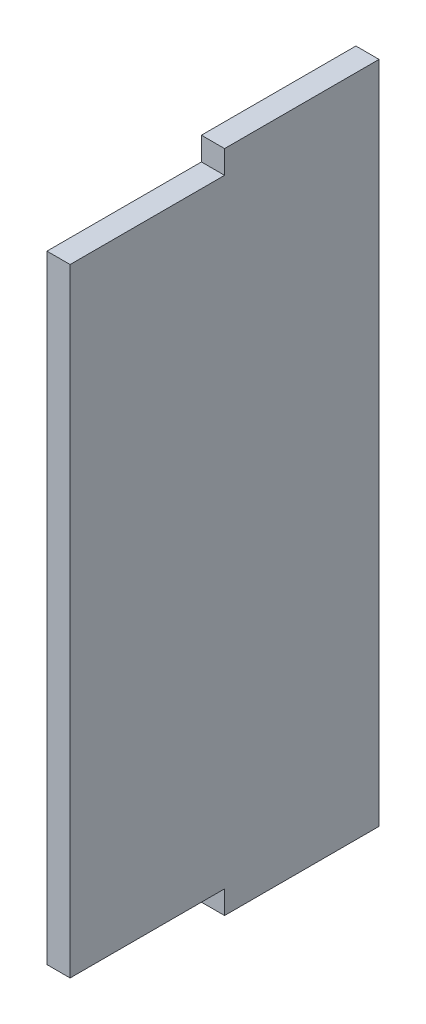
ISO-10303-21;
HEADER;
FILE_DESCRIPTION(('STEP AP214'),'2;1');
FILE_NAME('part.step','',(''),(''),'','','');
FILE_SCHEMA(('AUTOMOTIVE_DESIGN { 1 0 10303 214 1 1 1 1 }'));
ENDSEC;
DATA;
#1=APPLICATION_CONTEXT('core data for automotive mechanical design processes');
#2=APPLICATION_PROTOCOL_DEFINITION('international standard','automotive_design',2000,#1);
#3=PRODUCT_CONTEXT('',#1,'mechanical');
#4=PRODUCT('Part','Part','',(#3));
#5=PRODUCT_RELATED_PRODUCT_CATEGORY('part','',(#4));
#6=PRODUCT_DEFINITION_FORMATION('','',#4);
#7=PRODUCT_DEFINITION_CONTEXT('part definition',#1,'design');
#8=PRODUCT_DEFINITION('design','',#6,#7);
#9=PRODUCT_DEFINITION_SHAPE('','',#8);
#10=(LENGTH_UNIT() NAMED_UNIT(*) SI_UNIT(.MILLI.,.METRE.));
#11=(NAMED_UNIT(*) PLANE_ANGLE_UNIT() SI_UNIT($,.RADIAN.));
#12=(NAMED_UNIT(*) SI_UNIT($,.STERADIAN.) SOLID_ANGLE_UNIT());
#13=UNCERTAINTY_MEASURE_WITH_UNIT(LENGTH_MEASURE(1.E-05),#10,'distance_accuracy_value','');
#14=(GEOMETRIC_REPRESENTATION_CONTEXT(3) GLOBAL_UNCERTAINTY_ASSIGNED_CONTEXT((#13)) GLOBAL_UNIT_ASSIGNED_CONTEXT((#10,
#11,#12)) REPRESENTATION_CONTEXT('',''));
#15=CARTESIAN_POINT('',(0.,0.,0.));
#16=DIRECTION('',(0.,0.,1.));
#17=DIRECTION('',(1.,0.,0.));
#18=AXIS2_PLACEMENT_3D('',#15,#16,#17);
#19=CARTESIAN_POINT('',(-3.,3.,20.));
#20=DIRECTION('',(0.,1.,0.));
#21=DIRECTION('',(0.,0.,1.));
#22=AXIS2_PLACEMENT_3D('',#19,#20,#21);
#23=PLANE('',#22);
#24=DIRECTION('',(0.,0.,1.));
#25=VECTOR('',#24,1.);
#26=CARTESIAN_POINT('',(0.,3.,20.));
#27=LINE('',#26,#25);
#28=CARTESIAN_POINT('',(0.,3.,20.));
#29=VERTEX_POINT('',#28);
#30=CARTESIAN_POINT('',(0.,3.,40.));
#31=VERTEX_POINT('',#30);
#32=EDGE_CURVE('E118',#29,#31,#27,.T.);
#33=ORIENTED_EDGE('',*,*,#32,.T.);
#34=DIRECTION('',(1.,0.,0.));
#35=VECTOR('',#34,1.);
#36=CARTESIAN_POINT('',(-3.,3.,40.));
#37=LINE('',#36,#35);
#38=CARTESIAN_POINT('',(-3.,3.,40.));
#39=VERTEX_POINT('',#38);
#40=EDGE_CURVE('E10',#39,#31,#37,.T.);
#41=ORIENTED_EDGE('',*,*,#40,.F.);
#42=DIRECTION('',(0.,0.,1.));
#43=VECTOR('',#42,1.);
#44=CARTESIAN_POINT('',(-3.,3.,20.));
#45=LINE('',#44,#43);
#46=CARTESIAN_POINT('',(-3.,3.,20.));
#47=VERTEX_POINT('',#46);
#48=EDGE_CURVE('E112',#47,#39,#45,.T.);
#49=ORIENTED_EDGE('',*,*,#48,.F.);
#50=DIRECTION('',(1.,0.,0.));
#51=VECTOR('',#50,1.);
#52=CARTESIAN_POINT('',(-3.,3.,20.));
#53=LINE('',#52,#51);
#54=EDGE_CURVE('E108',#47,#29,#53,.T.);
#55=ORIENTED_EDGE('',*,*,#54,.T.);
#56=EDGE_LOOP('',(#33,#41,#49,#55));
#57=FACE_BOUND('',#56,.T.);
#58=ADVANCED_FACE('F16',(#57),#23,.F.);
#59=CARTESIAN_POINT('',(-3.,3.,40.));
#60=DIRECTION('',(0.,0.,-1.));
#61=DIRECTION('',(-1.,0.,0.));
#62=AXIS2_PLACEMENT_3D('',#59,#60,#61);
#63=PLANE('',#62);
#64=DIRECTION('',(0.,1.,0.));
#65=VECTOR('',#64,1.);
#66=CARTESIAN_POINT('',(0.,3.,40.));
#67=LINE('',#66,#65);
#68=CARTESIAN_POINT('',(0.,83.,40.));
#69=VERTEX_POINT('',#68);
#70=EDGE_CURVE('E114',#31,#69,#67,.T.);
#71=ORIENTED_EDGE('',*,*,#70,.T.);
#72=DIRECTION('',(1.,0.,0.));
#73=VECTOR('',#72,1.);
#74=CARTESIAN_POINT('',(-2.99999999999999,83.,40.));
#75=LINE('',#74,#73);
#76=CARTESIAN_POINT('',(-2.99999999999999,83.,40.));
#77=VERTEX_POINT('',#76);
#78=EDGE_CURVE('E24',#77,#69,#75,.T.);
#79=ORIENTED_EDGE('',*,*,#78,.F.);
#80=DIRECTION('',(0.,1.,0.));
#81=VECTOR('',#80,1.);
#82=CARTESIAN_POINT('',(-3.,3.,40.));
#83=LINE('',#82,#81);
#84=EDGE_CURVE('E75',#39,#77,#83,.T.);
#85=ORIENTED_EDGE('',*,*,#84,.F.);
#86=ORIENTED_EDGE('',*,*,#40,.T.);
#87=EDGE_LOOP('',(#71,#79,#85,#86));
#88=FACE_BOUND('',#87,.T.);
#89=ADVANCED_FACE('F169',(#88),#63,.F.);
#90=CARTESIAN_POINT('',(-2.99999999999999,83.,40.));
#91=DIRECTION('',(0.,-1.,0.));
#92=DIRECTION('',(0.,0.,-1.));
#93=AXIS2_PLACEMENT_3D('',#90,#91,#92);
#94=PLANE('',#93);
#95=DIRECTION('',(0.,0.,-1.));
#96=VECTOR('',#95,1.);
#97=CARTESIAN_POINT('',(0.,83.,40.));
#98=LINE('',#97,#96);
#99=CARTESIAN_POINT('',(0.,83.,20.));
#100=VERTEX_POINT('',#99);
#101=EDGE_CURVE('E117',#69,#100,#98,.T.);
#102=ORIENTED_EDGE('',*,*,#101,.T.);
#103=DIRECTION('',(1.,0.,0.));
#104=VECTOR('',#103,1.);
#105=CARTESIAN_POINT('',(-2.99999999999999,83.,20.));
#106=LINE('',#105,#104);
#107=CARTESIAN_POINT('',(-2.99999999999999,83.,20.));
#108=VERTEX_POINT('',#107);
#109=EDGE_CURVE('E142',#108,#100,#106,.T.);
#110=ORIENTED_EDGE('',*,*,#109,.F.);
#111=DIRECTION('',(0.,0.,-1.));
#112=VECTOR('',#111,1.);
#113=CARTESIAN_POINT('',(-2.99999999999999,83.,40.));
#114=LINE('',#113,#112);
#115=EDGE_CURVE('E150',#77,#108,#114,.T.);
#116=ORIENTED_EDGE('',*,*,#115,.F.);
#117=ORIENTED_EDGE('',*,*,#78,.T.);
#118=EDGE_LOOP('',(#102,#110,#116,#117));
#119=FACE_BOUND('',#118,.T.);
#120=ADVANCED_FACE('F148',(#119),#94,.F.);
#121=CARTESIAN_POINT('',(-2.99999999999999,83.,20.));
#122=DIRECTION('',(0.,0.,-1.));
#123=DIRECTION('',(-1.,0.,0.));
#124=AXIS2_PLACEMENT_3D('',#121,#122,#123);
#125=PLANE('',#124);
#126=DIRECTION('',(0.,1.,0.));
#127=VECTOR('',#126,1.);
#128=CARTESIAN_POINT('',(0.,83.,20.));
#129=LINE('',#128,#127);
#130=CARTESIAN_POINT('',(0.,86.,20.));
#131=VERTEX_POINT('',#130);
#132=EDGE_CURVE('E121',#100,#131,#129,.T.);
#133=ORIENTED_EDGE('',*,*,#132,.T.);
#134=DIRECTION('',(1.,0.,0.));
#135=VECTOR('',#134,1.);
#136=CARTESIAN_POINT('',(-2.99999999999999,86.,20.));
#137=LINE('',#136,#135);
#138=CARTESIAN_POINT('',(-2.99999999999999,86.,20.));
#139=VERTEX_POINT('',#138);
#140=EDGE_CURVE('E139',#139,#131,#137,.T.);
#141=ORIENTED_EDGE('',*,*,#140,.F.);
#142=DIRECTION('',(0.,1.,0.));
#143=VECTOR('',#142,1.);
#144=CARTESIAN_POINT('',(-2.99999999999999,83.,20.));
#145=LINE('',#144,#143);
#146=EDGE_CURVE('E162',#108,#139,#145,.T.);
#147=ORIENTED_EDGE('',*,*,#146,.F.);
#148=ORIENTED_EDGE('',*,*,#109,.T.);
#149=EDGE_LOOP('',(#133,#141,#147,#148));
#150=FACE_BOUND('',#149,.T.);
#151=ADVANCED_FACE('F158',(#150),#125,.F.);
#152=CARTESIAN_POINT('',(-2.99999999999999,86.,20.));
#153=DIRECTION('',(0.,-1.,0.));
#154=DIRECTION('',(0.,0.,-1.));
#155=AXIS2_PLACEMENT_3D('',#152,#153,#154);
#156=PLANE('',#155);
#157=DIRECTION('',(0.,0.,-1.));
#158=VECTOR('',#157,1.);
#159=CARTESIAN_POINT('',(0.,86.,20.));
#160=LINE('',#159,#158);
#161=CARTESIAN_POINT('',(0.,86.,0.));
#162=VERTEX_POINT('',#161);
#163=EDGE_CURVE('E124',#131,#162,#160,.T.);
#164=ORIENTED_EDGE('',*,*,#163,.T.);
#165=DIRECTION('',(1.,0.,0.));
#166=VECTOR('',#165,1.);
#167=CARTESIAN_POINT('',(-2.99999999999999,86.,0.));
#168=LINE('',#167,#166);
#169=CARTESIAN_POINT('',(-2.99999999999999,86.,0.));
#170=VERTEX_POINT('',#169);
#171=EDGE_CURVE('E103',#170,#162,#168,.T.);
#172=ORIENTED_EDGE('',*,*,#171,.F.);
#173=DIRECTION('',(0.,0.,-1.));
#174=VECTOR('',#173,1.);
#175=CARTESIAN_POINT('',(-2.99999999999999,86.,20.));
#176=LINE('',#175,#174);
#177=EDGE_CURVE('E94',#139,#170,#176,.T.);
#178=ORIENTED_EDGE('',*,*,#177,.F.);
#179=ORIENTED_EDGE('',*,*,#140,.T.);
#180=EDGE_LOOP('',(#164,#172,#178,#179));
#181=FACE_BOUND('',#180,.T.);
#182=ADVANCED_FACE('F161',(#181),#156,.F.);
#183=CARTESIAN_POINT('',(-2.99999999999999,86.,0.));
#184=DIRECTION('',(0.,0.,1.));
#185=DIRECTION('',(0.,-1.,0.));
#186=AXIS2_PLACEMENT_3D('',#183,#184,#185);
#187=PLANE('',#186);
#188=DIRECTION('',(0.,-1.,0.));
#189=VECTOR('',#188,1.);
#190=CARTESIAN_POINT('',(0.,86.,0.));
#191=LINE('',#190,#189);
#192=CARTESIAN_POINT('',(0.,0.,0.));
#193=VERTEX_POINT('',#192);
#194=EDGE_CURVE('E102',#162,#193,#191,.T.);
#195=ORIENTED_EDGE('',*,*,#194,.T.);
#196=DIRECTION('',(1.,0.,0.));
#197=VECTOR('',#196,1.);
#198=CARTESIAN_POINT('',(-3.,0.,0.));
#199=LINE('',#198,#197);
#200=CARTESIAN_POINT('',(-3.,0.,0.));
#201=VERTEX_POINT('',#200);
#202=EDGE_CURVE('E99',#201,#193,#199,.T.);
#203=ORIENTED_EDGE('',*,*,#202,.F.);
#204=DIRECTION('',(0.,-1.,0.));
#205=VECTOR('',#204,1.);
#206=CARTESIAN_POINT('',(-2.99999999999999,86.,0.));
#207=LINE('',#206,#205);
#208=EDGE_CURVE('E88',#170,#201,#207,.T.);
#209=ORIENTED_EDGE('',*,*,#208,.F.);
#210=ORIENTED_EDGE('',*,*,#171,.T.);
#211=EDGE_LOOP('',(#195,#203,#209,#210));
#212=FACE_BOUND('',#211,.T.);
#213=ADVANCED_FACE('F100',(#212),#187,.F.);
#214=CARTESIAN_POINT('',(-3.,0.,0.));
#215=DIRECTION('',(0.,1.,0.));
#216=DIRECTION('',(0.,0.,1.));
#217=AXIS2_PLACEMENT_3D('',#214,#215,#216);
#218=PLANE('',#217);
#219=DIRECTION('',(0.,0.,1.));
#220=VECTOR('',#219,1.);
#221=CARTESIAN_POINT('',(0.,0.,0.));
#222=LINE('',#221,#220);
#223=CARTESIAN_POINT('',(0.,0.,20.));
#224=VERTEX_POINT('',#223);
#225=EDGE_CURVE('E61',#193,#224,#222,.T.);
#226=ORIENTED_EDGE('',*,*,#225,.T.);
#227=DIRECTION('',(1.,0.,0.));
#228=VECTOR('',#227,1.);
#229=CARTESIAN_POINT('',(-3.,0.,20.));
#230=LINE('',#229,#228);
#231=CARTESIAN_POINT('',(-3.,0.,20.));
#232=VERTEX_POINT('',#231);
#233=EDGE_CURVE('E104',#232,#224,#230,.T.);
#234=ORIENTED_EDGE('',*,*,#233,.F.);
#235=DIRECTION('',(0.,0.,1.));
#236=VECTOR('',#235,1.);
#237=CARTESIAN_POINT('',(-3.,0.,0.));
#238=LINE('',#237,#236);
#239=EDGE_CURVE('E92',#201,#232,#238,.T.);
#240=ORIENTED_EDGE('',*,*,#239,.F.);
#241=ORIENTED_EDGE('',*,*,#202,.T.);
#242=EDGE_LOOP('',(#226,#234,#240,#241));
#243=FACE_BOUND('',#242,.T.);
#244=ADVANCED_FACE('F106',(#243),#218,.F.);
#245=CARTESIAN_POINT('',(-3.,0.,20.));
#246=DIRECTION('',(0.,0.,-1.));
#247=DIRECTION('',(0.,1.,0.));
#248=AXIS2_PLACEMENT_3D('',#245,#246,#247);
#249=PLANE('',#248);
#250=DIRECTION('',(0.,1.,0.));
#251=VECTOR('',#250,1.);
#252=CARTESIAN_POINT('',(0.,0.,20.));
#253=LINE('',#252,#251);
#254=EDGE_CURVE('E67',#224,#29,#253,.T.);
#255=ORIENTED_EDGE('',*,*,#254,.T.);
#256=ORIENTED_EDGE('',*,*,#54,.F.);
#257=DIRECTION('',(0.,1.,0.));
#258=VECTOR('',#257,1.);
#259=CARTESIAN_POINT('',(-3.,0.,20.));
#260=LINE('',#259,#258);
#261=EDGE_CURVE('E32',#232,#47,#260,.T.);
#262=ORIENTED_EDGE('',*,*,#261,.F.);
#263=ORIENTED_EDGE('',*,*,#233,.T.);
#264=EDGE_LOOP('',(#255,#256,#262,#263));
#265=FACE_BOUND('',#264,.T.);
#266=ADVANCED_FACE('F186',(#265),#249,.F.);
#267=CARTESIAN_POINT('',(-3.,0.,0.));
#268=DIRECTION('',(-1.,0.,0.));
#269=DIRECTION('',(0.,-1.,0.));
#270=AXIS2_PLACEMENT_3D('',#267,#268,#269);
#271=PLANE('',#270);
#272=ORIENTED_EDGE('',*,*,#48,.T.);
#273=ORIENTED_EDGE('',*,*,#84,.T.);
#274=ORIENTED_EDGE('',*,*,#115,.T.);
#275=ORIENTED_EDGE('',*,*,#146,.T.);
#276=ORIENTED_EDGE('',*,*,#177,.T.);
#277=ORIENTED_EDGE('',*,*,#208,.T.);
#278=ORIENTED_EDGE('',*,*,#239,.T.);
#279=ORIENTED_EDGE('',*,*,#261,.T.);
#280=EDGE_LOOP('',(#272,#273,#274,#275,#276,#277,#278,#279));
#281=FACE_BOUND('',#280,.T.);
#282=ADVANCED_FACE('F90',(#281),#271,.T.);
#283=CARTESIAN_POINT('',(0.,0.,0.));
#284=DIRECTION('',(-1.,0.,0.));
#285=DIRECTION('',(0.,-1.,0.));
#286=AXIS2_PLACEMENT_3D('',#283,#284,#285);
#287=PLANE('',#286);
#288=ORIENTED_EDGE('',*,*,#32,.F.);
#289=ORIENTED_EDGE('',*,*,#254,.F.);
#290=ORIENTED_EDGE('',*,*,#225,.F.);
#291=ORIENTED_EDGE('',*,*,#194,.F.);
#292=ORIENTED_EDGE('',*,*,#163,.F.);
#293=ORIENTED_EDGE('',*,*,#132,.F.);
#294=ORIENTED_EDGE('',*,*,#101,.F.);
#295=ORIENTED_EDGE('',*,*,#70,.F.);
#296=EDGE_LOOP('',(#288,#289,#290,#291,#292,#293,#294,#295));
#297=FACE_BOUND('',#296,.T.);
#298=ADVANCED_FACE('F154',(#297),#287,.F.);
#299=CLOSED_SHELL('',(#58,#89,#120,#151,#182,#213,#244,#266,#282,#298));
#300=MANIFOLD_SOLID_BREP('B1',#299);
#301=ADVANCED_BREP_SHAPE_REPRESENTATION('',(#18,#300),#14);
#302=SHAPE_DEFINITION_REPRESENTATION(#9,#301);
ENDSEC;
END-ISO-10303-21;
